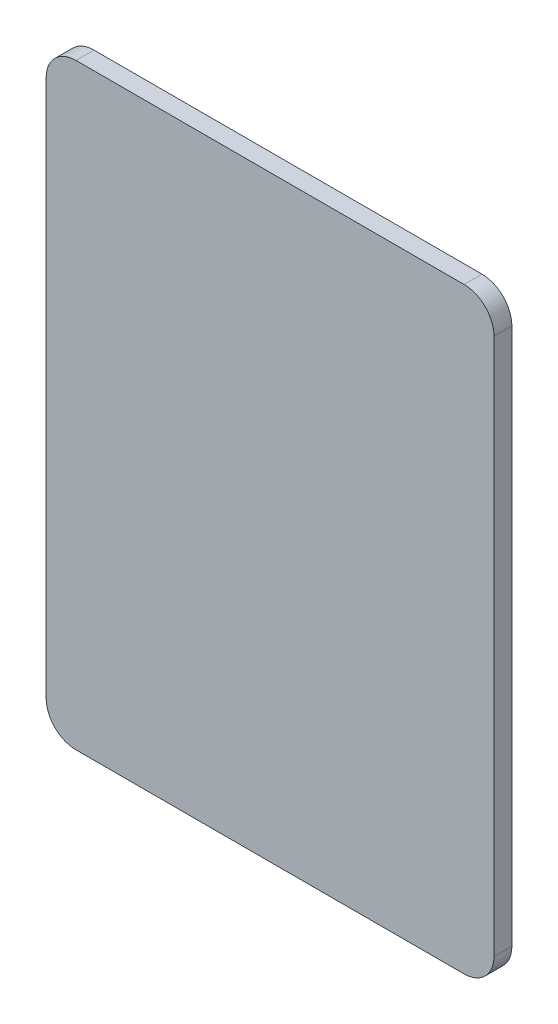
ISO-10303-21;
HEADER;
FILE_DESCRIPTION(('STEP AP214'),'2;1');
FILE_NAME('part.step','',(''),(''),'','','');
FILE_SCHEMA(('AUTOMOTIVE_DESIGN { 1 0 10303 214 1 1 1 1 }'));
ENDSEC;
DATA;
#1=APPLICATION_CONTEXT('core data for automotive mechanical design processes');
#2=APPLICATION_PROTOCOL_DEFINITION('international standard','automotive_design',2000,#1);
#3=PRODUCT_CONTEXT('',#1,'mechanical');
#4=PRODUCT('Part','Part','',(#3));
#5=PRODUCT_RELATED_PRODUCT_CATEGORY('part','',(#4));
#6=PRODUCT_DEFINITION_FORMATION('','',#4);
#7=PRODUCT_DEFINITION_CONTEXT('part definition',#1,'design');
#8=PRODUCT_DEFINITION('design','',#6,#7);
#9=PRODUCT_DEFINITION_SHAPE('','',#8);
#10=(LENGTH_UNIT() NAMED_UNIT(*) SI_UNIT(.MILLI.,.METRE.));
#11=(NAMED_UNIT(*) PLANE_ANGLE_UNIT() SI_UNIT($,.RADIAN.));
#12=(NAMED_UNIT(*) SI_UNIT($,.STERADIAN.) SOLID_ANGLE_UNIT());
#13=UNCERTAINTY_MEASURE_WITH_UNIT(LENGTH_MEASURE(1.E-05),#10,'distance_accuracy_value','');
#14=(GEOMETRIC_REPRESENTATION_CONTEXT(3) GLOBAL_UNCERTAINTY_ASSIGNED_CONTEXT((#13)) GLOBAL_UNIT_ASSIGNED_CONTEXT((#10,
#11,#12)) REPRESENTATION_CONTEXT('',''));
#15=CARTESIAN_POINT('',(0.,0.,0.));
#16=DIRECTION('',(0.,0.,1.));
#17=DIRECTION('',(1.,0.,0.));
#18=AXIS2_PLACEMENT_3D('',#15,#16,#17);
#19=CARTESIAN_POINT('',(-75.,99.9999999999999,6.));
#20=DIRECTION('',(1.,0.,0.));
#21=DIRECTION('',(0.,1.,0.));
#22=AXIS2_PLACEMENT_3D('',#19,#20,#21);
#23=PLANE('',#22);
#24=DIRECTION('',(0.,-1.,0.));
#25=VECTOR('',#24,1.);
#26=CARTESIAN_POINT('',(-75.,99.9999999999999,0.));
#27=LINE('',#26,#25);
#28=CARTESIAN_POINT('',(-75.,90.,0.));
#29=VERTEX_POINT('',#28);
#30=CARTESIAN_POINT('',(-75.,-90.0000000000001,0.));
#31=VERTEX_POINT('',#30);
#32=EDGE_CURVE('E147',#29,#31,#27,.T.);
#33=ORIENTED_EDGE('',*,*,#32,.T.);
#34=DIRECTION('',(0.,0.,-1.));
#35=VECTOR('',#34,1.);
#36=CARTESIAN_POINT('',(-75.,-90.0000000000001,6.));
#37=LINE('',#36,#35);
#38=CARTESIAN_POINT('',(-75.,-90.0000000000001,6.));
#39=VERTEX_POINT('',#38);
#40=EDGE_CURVE('E122',#31,#39,#37,.F.);
#41=ORIENTED_EDGE('',*,*,#40,.T.);
#42=DIRECTION('',(0.,-1.,0.));
#43=VECTOR('',#42,1.);
#44=CARTESIAN_POINT('',(-75.,99.9999999999999,6.));
#45=LINE('',#44,#43);
#46=CARTESIAN_POINT('',(-75.,90.,6.));
#47=VERTEX_POINT('',#46);
#48=EDGE_CURVE('E160',#47,#39,#45,.T.);
#49=ORIENTED_EDGE('',*,*,#48,.F.);
#50=DIRECTION('',(0.,0.,-1.));
#51=VECTOR('',#50,1.);
#52=CARTESIAN_POINT('',(-75.,90.,6.));
#53=LINE('',#52,#51);
#54=EDGE_CURVE('E128',#47,#29,#53,.T.);
#55=ORIENTED_EDGE('',*,*,#54,.T.);
#56=EDGE_LOOP('',(#33,#41,#49,#55));
#57=FACE_BOUND('',#56,.T.);
#58=ADVANCED_FACE('F40',(#57),#23,.F.);
#59=CARTESIAN_POINT('',(75.,-100.,6.));
#60=DIRECTION('',(0.,1.,0.));
#61=DIRECTION('',(-1.,0.,0.));
#62=AXIS2_PLACEMENT_3D('',#59,#60,#61);
#63=PLANE('',#62);
#64=DIRECTION('',(1.,0.,0.));
#65=VECTOR('',#64,1.);
#66=CARTESIAN_POINT('',(75.,-100.,6.));
#67=LINE('',#66,#65);
#68=CARTESIAN_POINT('',(-65.,-100.,6.));
#69=VERTEX_POINT('',#68);
#70=CARTESIAN_POINT('',(65.,-100.,6.));
#71=VERTEX_POINT('',#70);
#72=EDGE_CURVE('E138',#69,#71,#67,.T.);
#73=ORIENTED_EDGE('',*,*,#72,.F.);
#74=DIRECTION('',(0.,0.,-1.));
#75=VECTOR('',#74,1.);
#76=CARTESIAN_POINT('',(-65.,-100.,6.));
#77=LINE('',#76,#75);
#78=CARTESIAN_POINT('',(-65.,-100.,0.));
#79=VERTEX_POINT('',#78);
#80=EDGE_CURVE('E121',#69,#79,#77,.T.);
#81=ORIENTED_EDGE('',*,*,#80,.T.);
#82=DIRECTION('',(1.,0.,0.));
#83=VECTOR('',#82,1.);
#84=CARTESIAN_POINT('',(75.,-100.,0.));
#85=LINE('',#84,#83);
#86=CARTESIAN_POINT('',(65.,-100.,0.));
#87=VERTEX_POINT('',#86);
#88=EDGE_CURVE('E135',#79,#87,#85,.T.);
#89=ORIENTED_EDGE('',*,*,#88,.T.);
#90=DIRECTION('',(0.,0.,-1.));
#91=VECTOR('',#90,1.);
#92=CARTESIAN_POINT('',(65.,-100.,6.));
#93=LINE('',#92,#91);
#94=EDGE_CURVE('E141',#87,#71,#93,.F.);
#95=ORIENTED_EDGE('',*,*,#94,.T.);
#96=EDGE_LOOP('',(#73,#81,#89,#95));
#97=FACE_BOUND('',#96,.T.);
#98=ADVANCED_FACE('F134',(#97),#63,.F.);
#99=CARTESIAN_POINT('',(75.,100.,6.));
#100=DIRECTION('',(-1.,0.,0.));
#101=DIRECTION('',(0.,-1.,0.));
#102=AXIS2_PLACEMENT_3D('',#99,#100,#101);
#103=PLANE('',#102);
#104=DIRECTION('',(0.,1.,0.));
#105=VECTOR('',#104,1.);
#106=CARTESIAN_POINT('',(75.,100.,6.));
#107=LINE('',#106,#105);
#108=CARTESIAN_POINT('',(75.,-90.,6.));
#109=VERTEX_POINT('',#108);
#110=CARTESIAN_POINT('',(75.,90.,6.));
#111=VERTEX_POINT('',#110);
#112=EDGE_CURVE('E206',#109,#111,#107,.T.);
#113=ORIENTED_EDGE('',*,*,#112,.F.);
#114=DIRECTION('',(0.,0.,-1.));
#115=VECTOR('',#114,1.);
#116=CARTESIAN_POINT('',(75.,-90.,6.));
#117=LINE('',#116,#115);
#118=CARTESIAN_POINT('',(75.,-90.,0.));
#119=VERTEX_POINT('',#118);
#120=EDGE_CURVE('E186',#109,#119,#117,.T.);
#121=ORIENTED_EDGE('',*,*,#120,.T.);
#122=DIRECTION('',(0.,1.,0.));
#123=VECTOR('',#122,1.);
#124=CARTESIAN_POINT('',(75.,100.,0.));
#125=LINE('',#124,#123);
#126=CARTESIAN_POINT('',(75.,90.,0.));
#127=VERTEX_POINT('',#126);
#128=EDGE_CURVE('E146',#119,#127,#125,.T.);
#129=ORIENTED_EDGE('',*,*,#128,.T.);
#130=DIRECTION('',(0.,0.,-1.));
#131=VECTOR('',#130,1.);
#132=CARTESIAN_POINT('',(75.,90.,6.));
#133=LINE('',#132,#131);
#134=EDGE_CURVE('E183',#127,#111,#133,.F.);
#135=ORIENTED_EDGE('',*,*,#134,.T.);
#136=EDGE_LOOP('',(#113,#121,#129,#135));
#137=FACE_BOUND('',#136,.T.);
#138=ADVANCED_FACE('F218',(#137),#103,.F.);
#139=CARTESIAN_POINT('',(75.,100.,6.));
#140=DIRECTION('',(0.,-1.,0.));
#141=DIRECTION('',(1.,0.,0.));
#142=AXIS2_PLACEMENT_3D('',#139,#140,#141);
#143=PLANE('',#142);
#144=DIRECTION('',(-1.,0.,0.));
#145=VECTOR('',#144,1.);
#146=CARTESIAN_POINT('',(75.,100.,0.));
#147=LINE('',#146,#145);
#148=CARTESIAN_POINT('',(65.,100.,0.));
#149=VERTEX_POINT('',#148);
#150=CARTESIAN_POINT('',(-65.,99.9999999999999,0.));
#151=VERTEX_POINT('',#150);
#152=EDGE_CURVE('E152',#149,#151,#147,.T.);
#153=ORIENTED_EDGE('',*,*,#152,.T.);
#154=DIRECTION('',(0.,0.,-1.));
#155=VECTOR('',#154,1.);
#156=CARTESIAN_POINT('',(-65.,99.9999999999999,6.));
#157=LINE('',#156,#155);
#158=CARTESIAN_POINT('',(-65.,99.9999999999999,6.));
#159=VERTEX_POINT('',#158);
#160=EDGE_CURVE('E11',#151,#159,#157,.F.);
#161=ORIENTED_EDGE('',*,*,#160,.T.);
#162=DIRECTION('',(-1.,0.,0.));
#163=VECTOR('',#162,1.);
#164=CARTESIAN_POINT('',(75.,100.,6.));
#165=LINE('',#164,#163);
#166=CARTESIAN_POINT('',(65.,100.,6.));
#167=VERTEX_POINT('',#166);
#168=EDGE_CURVE('E162',#167,#159,#165,.T.);
#169=ORIENTED_EDGE('',*,*,#168,.F.);
#170=DIRECTION('',(0.,0.,-1.));
#171=VECTOR('',#170,1.);
#172=CARTESIAN_POINT('',(65.,100.,6.));
#173=LINE('',#172,#171);
#174=EDGE_CURVE('E48',#167,#149,#173,.T.);
#175=ORIENTED_EDGE('',*,*,#174,.T.);
#176=EDGE_LOOP('',(#153,#161,#169,#175));
#177=FACE_BOUND('',#176,.T.);
#178=ADVANCED_FACE('F194',(#177),#143,.F.);
#179=CARTESIAN_POINT('',(0.,0.,6.));
#180=DIRECTION('',(0.,0.,-1.));
#181=DIRECTION('',(-1.,0.,0.));
#182=AXIS2_PLACEMENT_3D('',#179,#180,#181);
#183=PLANE('',#182);
#184=ORIENTED_EDGE('',*,*,#48,.T.);
#185=CARTESIAN_POINT('',(-65.,-90.0000000000001,6.));
#186=DIRECTION('',(0.,0.,-1.));
#187=DIRECTION('',(-1.,0.,0.));
#188=AXIS2_PLACEMENT_3D('',#185,#186,#187);
#189=CIRCLE('',#188,10.);
#190=EDGE_CURVE('E180',#39,#69,#189,.F.);
#191=ORIENTED_EDGE('',*,*,#190,.T.);
#192=ORIENTED_EDGE('',*,*,#72,.T.);
#193=CARTESIAN_POINT('',(65.,-90.,6.));
#194=DIRECTION('',(0.,0.,-1.));
#195=DIRECTION('',(-1.,0.,0.));
#196=AXIS2_PLACEMENT_3D('',#193,#194,#195);
#197=CIRCLE('',#196,10.);
#198=EDGE_CURVE('E177',#71,#109,#197,.F.);
#199=ORIENTED_EDGE('',*,*,#198,.T.);
#200=ORIENTED_EDGE('',*,*,#112,.T.);
#201=CARTESIAN_POINT('',(65.,90.,6.));
#202=DIRECTION('',(0.,0.,-1.));
#203=DIRECTION('',(-1.,0.,0.));
#204=AXIS2_PLACEMENT_3D('',#201,#202,#203);
#205=CIRCLE('',#204,10.);
#206=EDGE_CURVE('E62',#111,#167,#205,.F.);
#207=ORIENTED_EDGE('',*,*,#206,.T.);
#208=ORIENTED_EDGE('',*,*,#168,.T.);
#209=CARTESIAN_POINT('',(-65.,90.,6.));
#210=DIRECTION('',(0.,0.,-1.));
#211=DIRECTION('',(-1.,0.,0.));
#212=AXIS2_PLACEMENT_3D('',#209,#210,#211);
#213=CIRCLE('',#212,10.);
#214=EDGE_CURVE('E175',#159,#47,#213,.F.);
#215=ORIENTED_EDGE('',*,*,#214,.T.);
#216=EDGE_LOOP('',(#184,#191,#192,#199,#200,#207,#208,#215));
#217=FACE_BOUND('',#216,.T.);
#218=ADVANCED_FACE('F210',(#217),#183,.F.);
#219=CARTESIAN_POINT('',(0.,0.,0.));
#220=DIRECTION('',(0.,0.,-1.));
#221=DIRECTION('',(-1.,0.,0.));
#222=AXIS2_PLACEMENT_3D('',#219,#220,#221);
#223=PLANE('',#222);
#224=ORIENTED_EDGE('',*,*,#88,.F.);
#225=CARTESIAN_POINT('',(-65.,-90.0000000000001,0.));
#226=DIRECTION('',(0.,0.,-1.));
#227=DIRECTION('',(-1.,0.,0.));
#228=AXIS2_PLACEMENT_3D('',#225,#226,#227);
#229=CIRCLE('',#228,10.);
#230=EDGE_CURVE('E117',#79,#31,#229,.T.);
#231=ORIENTED_EDGE('',*,*,#230,.T.);
#232=ORIENTED_EDGE('',*,*,#32,.F.);
#233=CARTESIAN_POINT('',(-65.,90.,0.));
#234=DIRECTION('',(0.,0.,-1.));
#235=DIRECTION('',(-1.,0.,0.));
#236=AXIS2_PLACEMENT_3D('',#233,#234,#235);
#237=CIRCLE('',#236,10.);
#238=EDGE_CURVE('E166',#29,#151,#237,.T.);
#239=ORIENTED_EDGE('',*,*,#238,.T.);
#240=ORIENTED_EDGE('',*,*,#152,.F.);
#241=CARTESIAN_POINT('',(65.,90.,0.));
#242=DIRECTION('',(0.,0.,-1.));
#243=DIRECTION('',(-1.,0.,0.));
#244=AXIS2_PLACEMENT_3D('',#241,#242,#243);
#245=CIRCLE('',#244,10.);
#246=EDGE_CURVE('E140',#149,#127,#245,.T.);
#247=ORIENTED_EDGE('',*,*,#246,.T.);
#248=ORIENTED_EDGE('',*,*,#128,.F.);
#249=CARTESIAN_POINT('',(65.,-90.,0.));
#250=DIRECTION('',(0.,0.,-1.));
#251=DIRECTION('',(-1.,0.,0.));
#252=AXIS2_PLACEMENT_3D('',#249,#250,#251);
#253=CIRCLE('',#252,10.);
#254=EDGE_CURVE('E129',#119,#87,#253,.T.);
#255=ORIENTED_EDGE('',*,*,#254,.T.);
#256=EDGE_LOOP('',(#224,#231,#232,#239,#240,#247,#248,#255));
#257=FACE_BOUND('',#256,.T.);
#258=ADVANCED_FACE('F143',(#257),#223,.T.);
#259=CARTESIAN_POINT('',(-65.,-90.0000000000001,6.));
#260=DIRECTION('',(0.,0.,-1.));
#261=DIRECTION('',(-1.,0.,0.));
#262=AXIS2_PLACEMENT_3D('',#259,#260,#261);
#263=CYLINDRICAL_SURFACE('',#262,10.);
#264=ORIENTED_EDGE('',*,*,#190,.F.);
#265=ORIENTED_EDGE('',*,*,#40,.F.);
#266=ORIENTED_EDGE('',*,*,#230,.F.);
#267=ORIENTED_EDGE('',*,*,#80,.F.);
#268=EDGE_LOOP('',(#264,#265,#266,#267));
#269=FACE_BOUND('',#268,.T.);
#270=ADVANCED_FACE('F120',(#269),#263,.T.);
#271=CARTESIAN_POINT('',(65.,-90.,6.));
#272=DIRECTION('',(0.,0.,-1.));
#273=DIRECTION('',(-1.,0.,0.));
#274=AXIS2_PLACEMENT_3D('',#271,#272,#273);
#275=CYLINDRICAL_SURFACE('',#274,10.);
#276=ORIENTED_EDGE('',*,*,#198,.F.);
#277=ORIENTED_EDGE('',*,*,#94,.F.);
#278=ORIENTED_EDGE('',*,*,#254,.F.);
#279=ORIENTED_EDGE('',*,*,#120,.F.);
#280=EDGE_LOOP('',(#276,#277,#278,#279));
#281=FACE_BOUND('',#280,.T.);
#282=ADVANCED_FACE('F230',(#281),#275,.T.);
#283=CARTESIAN_POINT('',(-65.,90.,6.));
#284=DIRECTION('',(0.,0.,-1.));
#285=DIRECTION('',(-1.,0.,0.));
#286=AXIS2_PLACEMENT_3D('',#283,#284,#285);
#287=CYLINDRICAL_SURFACE('',#286,10.);
#288=ORIENTED_EDGE('',*,*,#214,.F.);
#289=ORIENTED_EDGE('',*,*,#160,.F.);
#290=ORIENTED_EDGE('',*,*,#238,.F.);
#291=ORIENTED_EDGE('',*,*,#54,.F.);
#292=EDGE_LOOP('',(#288,#289,#290,#291));
#293=FACE_BOUND('',#292,.T.);
#294=ADVANCED_FACE('F199',(#293),#287,.T.);
#295=CARTESIAN_POINT('',(65.,90.,6.));
#296=DIRECTION('',(0.,0.,-1.));
#297=DIRECTION('',(-1.,0.,0.));
#298=AXIS2_PLACEMENT_3D('',#295,#296,#297);
#299=CYLINDRICAL_SURFACE('',#298,10.);
#300=ORIENTED_EDGE('',*,*,#206,.F.);
#301=ORIENTED_EDGE('',*,*,#134,.F.);
#302=ORIENTED_EDGE('',*,*,#246,.F.);
#303=ORIENTED_EDGE('',*,*,#174,.F.);
#304=EDGE_LOOP('',(#300,#301,#302,#303));
#305=FACE_BOUND('',#304,.T.);
#306=ADVANCED_FACE('F42',(#305),#299,.T.);
#307=CLOSED_SHELL('',(#58,#98,#138,#178,#218,#258,#270,#282,#294,#306));
#308=MANIFOLD_SOLID_BREP('B2',#307);
#309=ADVANCED_BREP_SHAPE_REPRESENTATION('',(#18,#308),#14);
#310=SHAPE_DEFINITION_REPRESENTATION(#9,#309);
ENDSEC;
END-ISO-10303-21;
